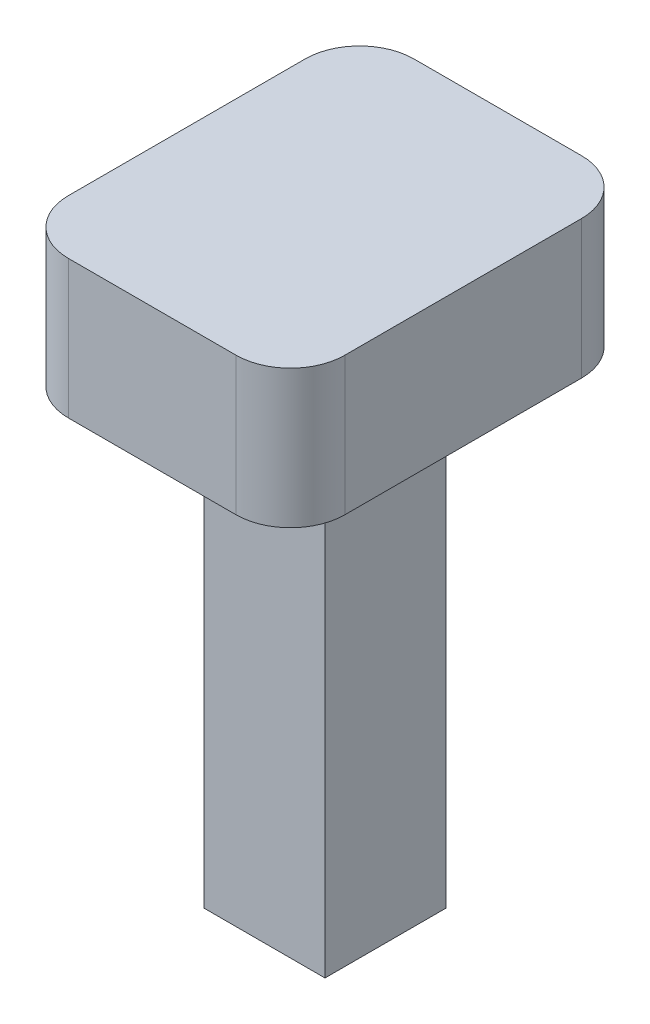
ISO-10303-21;
HEADER;
FILE_DESCRIPTION(('STEP AP214'),'2;1');
FILE_NAME('part.step','',(''),(''),'','','');
FILE_SCHEMA(('AUTOMOTIVE_DESIGN { 1 0 10303 214 1 1 1 1 }'));
ENDSEC;
DATA;
#1=APPLICATION_CONTEXT('core data for automotive mechanical design processes');
#2=APPLICATION_PROTOCOL_DEFINITION('international standard','automotive_design',2000,#1);
#3=PRODUCT_CONTEXT('',#1,'mechanical');
#4=PRODUCT('Part','Part','',(#3));
#5=PRODUCT_RELATED_PRODUCT_CATEGORY('part','',(#4));
#6=PRODUCT_DEFINITION_FORMATION('','',#4);
#7=PRODUCT_DEFINITION_CONTEXT('part definition',#1,'design');
#8=PRODUCT_DEFINITION('design','',#6,#7);
#9=PRODUCT_DEFINITION_SHAPE('','',#8);
#10=(LENGTH_UNIT() NAMED_UNIT(*) SI_UNIT(.MILLI.,.METRE.));
#11=(NAMED_UNIT(*) PLANE_ANGLE_UNIT() SI_UNIT($,.RADIAN.));
#12=(NAMED_UNIT(*) SI_UNIT($,.STERADIAN.) SOLID_ANGLE_UNIT());
#13=UNCERTAINTY_MEASURE_WITH_UNIT(LENGTH_MEASURE(1.E-05),#10,'distance_accuracy_value','');
#14=(GEOMETRIC_REPRESENTATION_CONTEXT(3) GLOBAL_UNCERTAINTY_ASSIGNED_CONTEXT((#13)) GLOBAL_UNIT_ASSIGNED_CONTEXT((#10,
#11,#12)) REPRESENTATION_CONTEXT('',''));
#15=CARTESIAN_POINT('',(0.,0.,0.));
#16=DIRECTION('',(0.,0.,1.));
#17=DIRECTION('',(1.,0.,0.));
#18=AXIS2_PLACEMENT_3D('',#15,#16,#17);
#19=CARTESIAN_POINT('',(1.3875,10.775,-1.3875));
#20=DIRECTION('',(-1.,0.,0.));
#21=DIRECTION('',(0.,0.,1.));
#22=AXIS2_PLACEMENT_3D('',#19,#20,#21);
#23=PLANE('',#22);
#24=DIRECTION('',(0.,-1.,0.));
#25=VECTOR('',#24,1.);
#26=CARTESIAN_POINT('',(1.3875,10.775,-1.3875));
#27=LINE('',#26,#25);
#28=CARTESIAN_POINT('',(1.3875,9.525,-1.3875));
#29=VERTEX_POINT('',#28);
#30=CARTESIAN_POINT('',(1.3875,0.,-1.3875));
#31=VERTEX_POINT('',#30);
#32=EDGE_CURVE('E151',#29,#31,#27,.T.);
#33=ORIENTED_EDGE('',*,*,#32,.F.);
#34=DIRECTION('',(0.,0.,-1.));
#35=VECTOR('',#34,1.);
#36=CARTESIAN_POINT('',(1.3875,9.525,1.3875));
#37=LINE('',#36,#35);
#38=CARTESIAN_POINT('',(1.3875,9.525,1.3875));
#39=VERTEX_POINT('',#38);
#40=EDGE_CURVE('E225',#29,#39,#37,.F.);
#41=ORIENTED_EDGE('',*,*,#40,.T.);
#42=DIRECTION('',(0.,-1.,0.));
#43=VECTOR('',#42,1.);
#44=CARTESIAN_POINT('',(1.3875,10.775,1.3875));
#45=LINE('',#44,#43);
#46=CARTESIAN_POINT('',(1.3875,0.,1.3875));
#47=VERTEX_POINT('',#46);
#48=EDGE_CURVE('E175',#39,#47,#45,.T.);
#49=ORIENTED_EDGE('',*,*,#48,.T.);
#50=DIRECTION('',(0.,0.,-1.));
#51=VECTOR('',#50,1.);
#52=CARTESIAN_POINT('',(1.3875,0.,-1.3875));
#53=LINE('',#52,#51);
#54=EDGE_CURVE('E169',#47,#31,#53,.T.);
#55=ORIENTED_EDGE('',*,*,#54,.T.);
#56=EDGE_LOOP('',(#33,#41,#49,#55));
#57=FACE_BOUND('',#56,.T.);
#58=ADVANCED_FACE('F45',(#57),#23,.F.);
#59=CARTESIAN_POINT('',(-1.3875,10.775,-1.3875));
#60=DIRECTION('',(0.,0.,1.));
#61=DIRECTION('',(1.,0.,0.));
#62=AXIS2_PLACEMENT_3D('',#59,#60,#61);
#63=PLANE('',#62);
#64=DIRECTION('',(0.,-1.,0.));
#65=VECTOR('',#64,1.);
#66=CARTESIAN_POINT('',(-1.3875,10.775,-1.3875));
#67=LINE('',#66,#65);
#68=CARTESIAN_POINT('',(-1.3875,9.525,-1.3875));
#69=VERTEX_POINT('',#68);
#70=CARTESIAN_POINT('',(-1.3875,0.,-1.3875));
#71=VERTEX_POINT('',#70);
#72=EDGE_CURVE('E163',#69,#71,#67,.T.);
#73=ORIENTED_EDGE('',*,*,#72,.F.);
#74=DIRECTION('',(-1.,0.,0.));
#75=VECTOR('',#74,1.);
#76=CARTESIAN_POINT('',(1.3875,9.525,-1.3875));
#77=LINE('',#76,#75);
#78=EDGE_CURVE('E158',#69,#29,#77,.F.);
#79=ORIENTED_EDGE('',*,*,#78,.T.);
#80=ORIENTED_EDGE('',*,*,#32,.T.);
#81=DIRECTION('',(-1.,0.,0.));
#82=VECTOR('',#81,1.);
#83=CARTESIAN_POINT('',(-1.3875,0.,-1.3875));
#84=LINE('',#83,#82);
#85=EDGE_CURVE('E155',#31,#71,#84,.T.);
#86=ORIENTED_EDGE('',*,*,#85,.T.);
#87=EDGE_LOOP('',(#73,#79,#80,#86));
#88=FACE_BOUND('',#87,.T.);
#89=ADVANCED_FACE('F154',(#88),#63,.F.);
#90=CARTESIAN_POINT('',(-1.3875,10.775,-1.3875));
#91=DIRECTION('',(1.,0.,0.));
#92=DIRECTION('',(0.,0.,-1.));
#93=AXIS2_PLACEMENT_3D('',#90,#91,#92);
#94=PLANE('',#93);
#95=DIRECTION('',(0.,-1.,0.));
#96=VECTOR('',#95,1.);
#97=CARTESIAN_POINT('',(-1.3875,10.775,1.3875));
#98=LINE('',#97,#96);
#99=CARTESIAN_POINT('',(-1.3875,9.525,1.3875));
#100=VERTEX_POINT('',#99);
#101=CARTESIAN_POINT('',(-1.3875,0.,1.3875));
#102=VERTEX_POINT('',#101);
#103=EDGE_CURVE('E194',#100,#102,#98,.T.);
#104=ORIENTED_EDGE('',*,*,#103,.F.);
#105=DIRECTION('',(0.,0.,1.));
#106=VECTOR('',#105,1.);
#107=CARTESIAN_POINT('',(-1.3875,9.525,-1.3875));
#108=LINE('',#107,#106);
#109=EDGE_CURVE('E231',#100,#69,#108,.F.);
#110=ORIENTED_EDGE('',*,*,#109,.T.);
#111=ORIENTED_EDGE('',*,*,#72,.T.);
#112=DIRECTION('',(0.,0.,1.));
#113=VECTOR('',#112,1.);
#114=CARTESIAN_POINT('',(-1.3875,0.,-1.3875));
#115=LINE('',#114,#113);
#116=EDGE_CURVE('E171',#71,#102,#115,.T.);
#117=ORIENTED_EDGE('',*,*,#116,.T.);
#118=EDGE_LOOP('',(#104,#110,#111,#117));
#119=FACE_BOUND('',#118,.T.);
#120=ADVANCED_FACE('F356',(#119),#94,.F.);
#121=CARTESIAN_POINT('',(-1.3875,10.775,1.3875));
#122=DIRECTION('',(0.,0.,-1.));
#123=DIRECTION('',(-1.,0.,0.));
#124=AXIS2_PLACEMENT_3D('',#121,#122,#123);
#125=PLANE('',#124);
#126=ORIENTED_EDGE('',*,*,#48,.F.);
#127=DIRECTION('',(1.,0.,0.));
#128=VECTOR('',#127,1.);
#129=CARTESIAN_POINT('',(-1.3875,9.525,1.3875));
#130=LINE('',#129,#128);
#131=EDGE_CURVE('E228',#39,#100,#130,.F.);
#132=ORIENTED_EDGE('',*,*,#131,.T.);
#133=ORIENTED_EDGE('',*,*,#103,.T.);
#134=DIRECTION('',(1.,0.,0.));
#135=VECTOR('',#134,1.);
#136=CARTESIAN_POINT('',(-1.3875,0.,1.3875));
#137=LINE('',#136,#135);
#138=EDGE_CURVE('E189',#102,#47,#137,.T.);
#139=ORIENTED_EDGE('',*,*,#138,.T.);
#140=EDGE_LOOP('',(#126,#132,#133,#139));
#141=FACE_BOUND('',#140,.T.);
#142=ADVANCED_FACE('F474',(#141),#125,.F.);
#143=CARTESIAN_POINT('',(0.,0.,0.));
#144=DIRECTION('',(0.,1.,0.));
#145=DIRECTION('',(0.,0.,1.));
#146=AXIS2_PLACEMENT_3D('',#143,#144,#145);
#147=PLANE('',#146);
#148=ORIENTED_EDGE('',*,*,#54,.F.);
#149=ORIENTED_EDGE('',*,*,#138,.F.);
#150=ORIENTED_EDGE('',*,*,#116,.F.);
#151=ORIENTED_EDGE('',*,*,#85,.F.);
#152=EDGE_LOOP('',(#148,#149,#150,#151));
#153=FACE_BOUND('',#152,.T.);
#154=ADVANCED_FACE('F167',(#153),#147,.F.);
#155=CARTESIAN_POINT('',(0.,10.775,0.));
#156=DIRECTION('',(0.,1.,0.));
#157=DIRECTION('',(0.,0.,1.));
#158=AXIS2_PLACEMENT_3D('',#155,#156,#157);
#159=PLANE('',#158);
#160=DIRECTION('',(0.,0.,-1.));
#161=VECTOR('',#160,1.);
#162=CARTESIAN_POINT('',(2.6375,10.775,-1.3875));
#163=LINE('',#162,#161);
#164=CARTESIAN_POINT('',(2.6375,10.775,2.6375));
#165=VERTEX_POINT('',#164);
#166=CARTESIAN_POINT('',(2.6375,10.775,-2.6375));
#167=VERTEX_POINT('',#166);
#168=EDGE_CURVE('E216',#165,#167,#163,.T.);
#169=ORIENTED_EDGE('',*,*,#168,.T.);
#170=DIRECTION('',(-1.,0.,0.));
#171=VECTOR('',#170,1.);
#172=CARTESIAN_POINT('',(-1.3875,10.775,-2.6375));
#173=LINE('',#172,#171);
#174=CARTESIAN_POINT('',(-2.6375,10.775,-2.6375));
#175=VERTEX_POINT('',#174);
#176=EDGE_CURVE('E219',#167,#175,#173,.T.);
#177=ORIENTED_EDGE('',*,*,#176,.T.);
#178=DIRECTION('',(0.,0.,1.));
#179=VECTOR('',#178,1.);
#180=CARTESIAN_POINT('',(-2.6375,10.775,1.3875));
#181=LINE('',#180,#179);
#182=CARTESIAN_POINT('',(-2.6375,10.775,2.6375));
#183=VERTEX_POINT('',#182);
#184=EDGE_CURVE('E210',#175,#183,#181,.T.);
#185=ORIENTED_EDGE('',*,*,#184,.T.);
#186=DIRECTION('',(1.,0.,0.));
#187=VECTOR('',#186,1.);
#188=CARTESIAN_POINT('',(1.3875,10.775,2.6375));
#189=LINE('',#188,#187);
#190=EDGE_CURVE('E213',#183,#165,#189,.T.);
#191=ORIENTED_EDGE('',*,*,#190,.T.);
#192=EDGE_LOOP('',(#169,#177,#185,#191));
#193=FACE_BOUND('',#192,.T.);
#194=DIRECTION('',(0.,0.,1.));
#195=VECTOR('',#194,1.);
#196=CARTESIAN_POINT('',(-3.175,10.775,-3.96875));
#197=LINE('',#196,#195);
#198=CARTESIAN_POINT('',(-3.175,10.775,-2.71875));
#199=VERTEX_POINT('',#198);
#200=CARTESIAN_POINT('',(-3.175,10.775,2.71875));
#201=VERTEX_POINT('',#200);
#202=EDGE_CURVE('E296',#199,#201,#197,.T.);
#203=ORIENTED_EDGE('',*,*,#202,.F.);
#204=CARTESIAN_POINT('',(-1.925,10.775,-2.71875));
#205=DIRECTION('',(0.,1.,0.));
#206=DIRECTION('',(0.,0.,1.));
#207=AXIS2_PLACEMENT_3D('',#204,#205,#206);
#208=CIRCLE('',#207,1.25);
#209=CARTESIAN_POINT('',(-1.925,10.775,-3.96875));
#210=VERTEX_POINT('',#209);
#211=EDGE_CURVE('E207',#199,#210,#208,.F.);
#212=ORIENTED_EDGE('',*,*,#211,.T.);
#213=DIRECTION('',(-1.,0.,0.));
#214=VECTOR('',#213,1.);
#215=CARTESIAN_POINT('',(-3.175,10.775,-3.96875));
#216=LINE('',#215,#214);
#217=CARTESIAN_POINT('',(1.925,10.775,-3.96875));
#218=VERTEX_POINT('',#217);
#219=EDGE_CURVE('E289',#218,#210,#216,.T.);
#220=ORIENTED_EDGE('',*,*,#219,.F.);
#221=CARTESIAN_POINT('',(1.925,10.775,-2.71875));
#222=DIRECTION('',(0.,1.,0.));
#223=DIRECTION('',(0.,0.,1.));
#224=AXIS2_PLACEMENT_3D('',#221,#222,#223);
#225=CIRCLE('',#224,1.25);
#226=CARTESIAN_POINT('',(3.175,10.775,-2.71875));
#227=VERTEX_POINT('',#226);
#228=EDGE_CURVE('E204',#218,#227,#225,.F.);
#229=ORIENTED_EDGE('',*,*,#228,.T.);
#230=DIRECTION('',(0.,0.,-1.));
#231=VECTOR('',#230,1.);
#232=CARTESIAN_POINT('',(3.175,10.775,-3.96875));
#233=LINE('',#232,#231);
#234=CARTESIAN_POINT('',(3.175,10.775,2.71875));
#235=VERTEX_POINT('',#234);
#236=EDGE_CURVE('E282',#235,#227,#233,.T.);
#237=ORIENTED_EDGE('',*,*,#236,.F.);
#238=CARTESIAN_POINT('',(1.925,10.775,2.71875));
#239=DIRECTION('',(0.,1.,0.));
#240=DIRECTION('',(0.,0.,1.));
#241=AXIS2_PLACEMENT_3D('',#238,#239,#240);
#242=CIRCLE('',#241,1.25);
#243=CARTESIAN_POINT('',(1.925,10.775,3.96875));
#244=VERTEX_POINT('',#243);
#245=EDGE_CURVE('E162',#235,#244,#242,.F.);
#246=ORIENTED_EDGE('',*,*,#245,.T.);
#247=DIRECTION('',(1.,0.,0.));
#248=VECTOR('',#247,1.);
#249=CARTESIAN_POINT('',(-3.175,10.775,3.96875));
#250=LINE('',#249,#248);
#251=CARTESIAN_POINT('',(-1.925,10.775,3.96875));
#252=VERTEX_POINT('',#251);
#253=EDGE_CURVE('E184',#252,#244,#250,.T.);
#254=ORIENTED_EDGE('',*,*,#253,.F.);
#255=CARTESIAN_POINT('',(-1.925,10.775,2.71875));
#256=DIRECTION('',(0.,1.,0.));
#257=DIRECTION('',(0.,0.,1.));
#258=AXIS2_PLACEMENT_3D('',#255,#256,#257);
#259=CIRCLE('',#258,1.25);
#260=EDGE_CURVE('E201',#252,#201,#259,.F.);
#261=ORIENTED_EDGE('',*,*,#260,.T.);
#262=EDGE_LOOP('',(#203,#212,#220,#229,#237,#246,#254,#261));
#263=FACE_BOUND('',#262,.T.);
#264=ADVANCED_FACE('F326',(#193,#263),#159,.F.);
#265=CARTESIAN_POINT('',(3.175,13.95,-3.96875));
#266=DIRECTION('',(-1.,0.,0.));
#267=DIRECTION('',(0.,0.,1.));
#268=AXIS2_PLACEMENT_3D('',#265,#266,#267);
#269=PLANE('',#268);
#270=ORIENTED_EDGE('',*,*,#236,.T.);
#271=DIRECTION('',(0.,-1.,0.));
#272=VECTOR('',#271,1.);
#273=CARTESIAN_POINT('',(3.175,13.95,-2.71875));
#274=LINE('',#273,#272);
#275=CARTESIAN_POINT('',(3.175,13.95,-2.71875));
#276=VERTEX_POINT('',#275);
#277=EDGE_CURVE('E263',#227,#276,#274,.F.);
#278=ORIENTED_EDGE('',*,*,#277,.T.);
#279=DIRECTION('',(0.,0.,-1.));
#280=VECTOR('',#279,1.);
#281=CARTESIAN_POINT('',(3.175,13.95,-3.96875));
#282=LINE('',#281,#280);
#283=CARTESIAN_POINT('',(3.175,13.95,2.71875));
#284=VERTEX_POINT('',#283);
#285=EDGE_CURVE('E305',#284,#276,#282,.T.);
#286=ORIENTED_EDGE('',*,*,#285,.F.);
#287=DIRECTION('',(0.,-1.,0.));
#288=VECTOR('',#287,1.);
#289=CARTESIAN_POINT('',(3.175,13.95,2.71875));
#290=LINE('',#289,#288);
#291=EDGE_CURVE('E259',#284,#235,#290,.T.);
#292=ORIENTED_EDGE('',*,*,#291,.T.);
#293=EDGE_LOOP('',(#270,#278,#286,#292));
#294=FACE_BOUND('',#293,.T.);
#295=ADVANCED_FACE('F330',(#294),#269,.F.);
#296=CARTESIAN_POINT('',(-3.175,13.95,-3.96875));
#297=DIRECTION('',(0.,0.,1.));
#298=DIRECTION('',(1.,0.,0.));
#299=AXIS2_PLACEMENT_3D('',#296,#297,#298);
#300=PLANE('',#299);
#301=ORIENTED_EDGE('',*,*,#219,.T.);
#302=DIRECTION('',(0.,-1.,0.));
#303=VECTOR('',#302,1.);
#304=CARTESIAN_POINT('',(-1.925,13.95,-3.96875));
#305=LINE('',#304,#303);
#306=CARTESIAN_POINT('',(-1.925,13.95,-3.96875));
#307=VERTEX_POINT('',#306);
#308=EDGE_CURVE('E245',#210,#307,#305,.F.);
#309=ORIENTED_EDGE('',*,*,#308,.T.);
#310=DIRECTION('',(-1.,0.,0.));
#311=VECTOR('',#310,1.);
#312=CARTESIAN_POINT('',(-3.175,13.95,-3.96875));
#313=LINE('',#312,#311);
#314=CARTESIAN_POINT('',(1.925,13.95,-3.96875));
#315=VERTEX_POINT('',#314);
#316=EDGE_CURVE('E309',#315,#307,#313,.T.);
#317=ORIENTED_EDGE('',*,*,#316,.F.);
#318=DIRECTION('',(0.,-1.,0.));
#319=VECTOR('',#318,1.);
#320=CARTESIAN_POINT('',(1.925,13.95,-3.96875));
#321=LINE('',#320,#319);
#322=EDGE_CURVE('E241',#315,#218,#321,.T.);
#323=ORIENTED_EDGE('',*,*,#322,.T.);
#324=EDGE_LOOP('',(#301,#309,#317,#323));
#325=FACE_BOUND('',#324,.T.);
#326=ADVANCED_FACE('F336',(#325),#300,.F.);
#327=CARTESIAN_POINT('',(-3.175,13.95,-3.96875));
#328=DIRECTION('',(1.,0.,0.));
#329=DIRECTION('',(0.,0.,-1.));
#330=AXIS2_PLACEMENT_3D('',#327,#328,#329);
#331=PLANE('',#330);
#332=DIRECTION('',(0.,0.,1.));
#333=VECTOR('',#332,1.);
#334=CARTESIAN_POINT('',(-3.175,13.95,-3.96875));
#335=LINE('',#334,#333);
#336=CARTESIAN_POINT('',(-3.175,13.95,-2.71875));
#337=VERTEX_POINT('',#336);
#338=CARTESIAN_POINT('',(-3.175,13.95,2.71875));
#339=VERTEX_POINT('',#338);
#340=EDGE_CURVE('E181',#337,#339,#335,.T.);
#341=ORIENTED_EDGE('',*,*,#340,.F.);
#342=DIRECTION('',(0.,-1.,0.));
#343=VECTOR('',#342,1.);
#344=CARTESIAN_POINT('',(-3.175,13.95,-2.71875));
#345=LINE('',#344,#343);
#346=EDGE_CURVE('E237',#337,#199,#345,.T.);
#347=ORIENTED_EDGE('',*,*,#346,.T.);
#348=ORIENTED_EDGE('',*,*,#202,.T.);
#349=DIRECTION('',(0.,-1.,0.));
#350=VECTOR('',#349,1.);
#351=CARTESIAN_POINT('',(-3.175,13.95,2.71875));
#352=LINE('',#351,#350);
#353=EDGE_CURVE('E234',#201,#339,#352,.F.);
#354=ORIENTED_EDGE('',*,*,#353,.T.);
#355=EDGE_LOOP('',(#341,#347,#348,#354));
#356=FACE_BOUND('',#355,.T.);
#357=ADVANCED_FACE('F341',(#356),#331,.F.);
#358=CARTESIAN_POINT('',(-3.175,13.95,3.96875));
#359=DIRECTION('',(0.,0.,-1.));
#360=DIRECTION('',(-1.,0.,0.));
#361=AXIS2_PLACEMENT_3D('',#358,#359,#360);
#362=PLANE('',#361);
#363=DIRECTION('',(1.,0.,0.));
#364=VECTOR('',#363,1.);
#365=CARTESIAN_POINT('',(-3.175,13.95,3.96875));
#366=LINE('',#365,#364);
#367=CARTESIAN_POINT('',(-1.925,13.95,3.96875));
#368=VERTEX_POINT('',#367);
#369=CARTESIAN_POINT('',(1.925,13.95,3.96875));
#370=VERTEX_POINT('',#369);
#371=EDGE_CURVE('E178',#368,#370,#366,.T.);
#372=ORIENTED_EDGE('',*,*,#371,.F.);
#373=DIRECTION('',(0.,-1.,0.));
#374=VECTOR('',#373,1.);
#375=CARTESIAN_POINT('',(-1.925,13.95,3.96875));
#376=LINE('',#375,#374);
#377=EDGE_CURVE('E11',#368,#252,#376,.T.);
#378=ORIENTED_EDGE('',*,*,#377,.T.);
#379=ORIENTED_EDGE('',*,*,#253,.T.);
#380=DIRECTION('',(0.,-1.,0.));
#381=VECTOR('',#380,1.);
#382=CARTESIAN_POINT('',(1.925,13.95,3.96875));
#383=LINE('',#382,#381);
#384=EDGE_CURVE('E55',#244,#370,#383,.F.);
#385=ORIENTED_EDGE('',*,*,#384,.T.);
#386=EDGE_LOOP('',(#372,#378,#379,#385));
#387=FACE_BOUND('',#386,.T.);
#388=ADVANCED_FACE('F324',(#387),#362,.F.);
#389=CARTESIAN_POINT('',(0.,13.95,0.));
#390=DIRECTION('',(0.,1.,0.));
#391=DIRECTION('',(0.,0.,1.));
#392=AXIS2_PLACEMENT_3D('',#389,#390,#391);
#393=PLANE('',#392);
#394=ORIENTED_EDGE('',*,*,#316,.T.);
#395=CARTESIAN_POINT('',(-1.925,13.95,-2.71875));
#396=DIRECTION('',(0.,1.,0.));
#397=DIRECTION('',(0.,0.,1.));
#398=AXIS2_PLACEMENT_3D('',#395,#396,#397);
#399=CIRCLE('',#398,1.25);
#400=EDGE_CURVE('E256',#307,#337,#399,.T.);
#401=ORIENTED_EDGE('',*,*,#400,.T.);
#402=ORIENTED_EDGE('',*,*,#340,.T.);
#403=CARTESIAN_POINT('',(-1.925,13.95,2.71875));
#404=DIRECTION('',(0.,1.,0.));
#405=DIRECTION('',(0.,0.,1.));
#406=AXIS2_PLACEMENT_3D('',#403,#404,#405);
#407=CIRCLE('',#406,1.25);
#408=EDGE_CURVE('E69',#339,#368,#407,.T.);
#409=ORIENTED_EDGE('',*,*,#408,.T.);
#410=ORIENTED_EDGE('',*,*,#371,.T.);
#411=CARTESIAN_POINT('',(1.925,13.95,2.71875));
#412=DIRECTION('',(0.,1.,0.));
#413=DIRECTION('',(0.,0.,1.));
#414=AXIS2_PLACEMENT_3D('',#411,#412,#413);
#415=CIRCLE('',#414,1.25);
#416=EDGE_CURVE('E248',#370,#284,#415,.T.);
#417=ORIENTED_EDGE('',*,*,#416,.T.);
#418=ORIENTED_EDGE('',*,*,#285,.T.);
#419=CARTESIAN_POINT('',(1.925,13.95,-2.71875));
#420=DIRECTION('',(0.,1.,0.));
#421=DIRECTION('',(0.,0.,1.));
#422=AXIS2_PLACEMENT_3D('',#419,#420,#421);
#423=CIRCLE('',#422,1.25);
#424=EDGE_CURVE('E253',#276,#315,#423,.T.);
#425=ORIENTED_EDGE('',*,*,#424,.T.);
#426=EDGE_LOOP('',(#394,#401,#402,#409,#410,#417,#418,#425));
#427=FACE_BOUND('',#426,.T.);
#428=ADVANCED_FACE('F318',(#427),#393,.T.);
#429=CARTESIAN_POINT('',(0.,9.525,2.6375));
#430=DIRECTION('',(-1.,0.,0.));
#431=DIRECTION('',(0.,0.,1.));
#432=AXIS2_PLACEMENT_3D('',#429,#430,#431);
#433=CYLINDRICAL_SURFACE('',#432,1.25);
#434=CARTESIAN_POINT('',(-2.6375,9.525,2.6375));
#435=DIRECTION('',(-0.707106781186547,0.,-0.707106781186547));
#436=DIRECTION('',(0.707106781186547,0.,-0.707106781186547));
#437=AXIS2_PLACEMENT_3D('',#434,#435,#436);
#438=ELLIPSE('',#437,1.76776695296637,1.25);
#439=EDGE_CURVE('E273',#100,#183,#438,.F.);
#440=ORIENTED_EDGE('',*,*,#439,.F.);
#441=ORIENTED_EDGE('',*,*,#131,.F.);
#442=CARTESIAN_POINT('',(2.6375,9.525,2.6375));
#443=DIRECTION('',(-0.707106781186547,0.,0.707106781186547));
#444=DIRECTION('',(-0.707106781186547,0.,-0.707106781186547));
#445=AXIS2_PLACEMENT_3D('',#442,#443,#444);
#446=ELLIPSE('',#445,1.76776695296637,1.25);
#447=EDGE_CURVE('E49',#165,#39,#446,.T.);
#448=ORIENTED_EDGE('',*,*,#447,.F.);
#449=ORIENTED_EDGE('',*,*,#190,.F.);
#450=EDGE_LOOP('',(#440,#441,#448,#449));
#451=FACE_BOUND('',#450,.T.);
#452=ADVANCED_FACE('F370',(#451),#433,.F.);
#453=CARTESIAN_POINT('',(2.6375,9.525,0.));
#454=DIRECTION('',(0.,0.,1.));
#455=DIRECTION('',(1.,0.,0.));
#456=AXIS2_PLACEMENT_3D('',#453,#454,#455);
#457=CYLINDRICAL_SURFACE('',#456,1.25);
#458=ORIENTED_EDGE('',*,*,#447,.T.);
#459=ORIENTED_EDGE('',*,*,#40,.F.);
#460=CARTESIAN_POINT('',(2.6375,9.525,-2.6375));
#461=DIRECTION('',(0.707106781186547,0.,0.707106781186547));
#462=DIRECTION('',(-0.707106781186547,0.,0.707106781186547));
#463=AXIS2_PLACEMENT_3D('',#460,#461,#462);
#464=ELLIPSE('',#463,1.76776695296637,1.25);
#465=EDGE_CURVE('E271',#167,#29,#464,.T.);
#466=ORIENTED_EDGE('',*,*,#465,.F.);
#467=ORIENTED_EDGE('',*,*,#168,.F.);
#468=EDGE_LOOP('',(#458,#459,#466,#467));
#469=FACE_BOUND('',#468,.T.);
#470=ADVANCED_FACE('F367',(#469),#457,.F.);
#471=CARTESIAN_POINT('',(-2.6375,9.525,0.));
#472=DIRECTION('',(0.,0.,-1.));
#473=DIRECTION('',(-1.,0.,0.));
#474=AXIS2_PLACEMENT_3D('',#471,#472,#473);
#475=CYLINDRICAL_SURFACE('',#474,1.25);
#476=ORIENTED_EDGE('',*,*,#439,.T.);
#477=ORIENTED_EDGE('',*,*,#184,.F.);
#478=CARTESIAN_POINT('',(-2.6375,9.525,-2.6375));
#479=DIRECTION('',(0.707106781186547,0.,-0.707106781186547));
#480=DIRECTION('',(-0.707106781186547,0.,-0.707106781186547));
#481=AXIS2_PLACEMENT_3D('',#478,#479,#480);
#482=ELLIPSE('',#481,1.76776695296637,1.25);
#483=EDGE_CURVE('E268',#69,#175,#482,.F.);
#484=ORIENTED_EDGE('',*,*,#483,.F.);
#485=ORIENTED_EDGE('',*,*,#109,.F.);
#486=EDGE_LOOP('',(#476,#477,#484,#485));
#487=FACE_BOUND('',#486,.T.);
#488=ADVANCED_FACE('F363',(#487),#475,.F.);
#489=CARTESIAN_POINT('',(0.,9.525,-2.6375));
#490=DIRECTION('',(1.,0.,0.));
#491=DIRECTION('',(0.,0.,-1.));
#492=AXIS2_PLACEMENT_3D('',#489,#490,#491);
#493=CYLINDRICAL_SURFACE('',#492,1.25);
#494=ORIENTED_EDGE('',*,*,#465,.T.);
#495=ORIENTED_EDGE('',*,*,#78,.F.);
#496=ORIENTED_EDGE('',*,*,#483,.T.);
#497=ORIENTED_EDGE('',*,*,#176,.F.);
#498=EDGE_LOOP('',(#494,#495,#496,#497));
#499=FACE_BOUND('',#498,.T.);
#500=ADVANCED_FACE('F360',(#499),#493,.F.);
#501=CARTESIAN_POINT('',(-1.925,13.95,-2.71875));
#502=DIRECTION('',(0.,-1.,0.));
#503=DIRECTION('',(0.,0.,-1.));
#504=AXIS2_PLACEMENT_3D('',#501,#502,#503);
#505=CYLINDRICAL_SURFACE('',#504,1.25);
#506=ORIENTED_EDGE('',*,*,#400,.F.);
#507=ORIENTED_EDGE('',*,*,#308,.F.);
#508=ORIENTED_EDGE('',*,*,#211,.F.);
#509=ORIENTED_EDGE('',*,*,#346,.F.);
#510=EDGE_LOOP('',(#506,#507,#508,#509));
#511=FACE_BOUND('',#510,.T.);
#512=ADVANCED_FACE('F340',(#511),#505,.T.);
#513=CARTESIAN_POINT('',(1.925,13.95,-2.71875));
#514=DIRECTION('',(0.,-1.,0.));
#515=DIRECTION('',(0.,0.,-1.));
#516=AXIS2_PLACEMENT_3D('',#513,#514,#515);
#517=CYLINDRICAL_SURFACE('',#516,1.25);
#518=ORIENTED_EDGE('',*,*,#424,.F.);
#519=ORIENTED_EDGE('',*,*,#277,.F.);
#520=ORIENTED_EDGE('',*,*,#228,.F.);
#521=ORIENTED_EDGE('',*,*,#322,.F.);
#522=EDGE_LOOP('',(#518,#519,#520,#521));
#523=FACE_BOUND('',#522,.T.);
#524=ADVANCED_FACE('F332',(#523),#517,.T.);
#525=CARTESIAN_POINT('',(-1.925,13.95,2.71875));
#526=DIRECTION('',(0.,-1.,0.));
#527=DIRECTION('',(0.,0.,-1.));
#528=AXIS2_PLACEMENT_3D('',#525,#526,#527);
#529=CYLINDRICAL_SURFACE('',#528,1.25);
#530=ORIENTED_EDGE('',*,*,#408,.F.);
#531=ORIENTED_EDGE('',*,*,#353,.F.);
#532=ORIENTED_EDGE('',*,*,#260,.F.);
#533=ORIENTED_EDGE('',*,*,#377,.F.);
#534=EDGE_LOOP('',(#530,#531,#532,#533));
#535=FACE_BOUND('',#534,.T.);
#536=ADVANCED_FACE('F323',(#535),#529,.T.);
#537=CARTESIAN_POINT('',(1.925,13.95,2.71875));
#538=DIRECTION('',(0.,-1.,0.));
#539=DIRECTION('',(0.,0.,-1.));
#540=AXIS2_PLACEMENT_3D('',#537,#538,#539);
#541=CYLINDRICAL_SURFACE('',#540,1.25);
#542=ORIENTED_EDGE('',*,*,#416,.F.);
#543=ORIENTED_EDGE('',*,*,#384,.F.);
#544=ORIENTED_EDGE('',*,*,#245,.F.);
#545=ORIENTED_EDGE('',*,*,#291,.F.);
#546=EDGE_LOOP('',(#542,#543,#544,#545));
#547=FACE_BOUND('',#546,.T.);
#548=ADVANCED_FACE('F47',(#547),#541,.T.);
#549=CLOSED_SHELL('',(#58,#89,#120,#142,#154,#264,#295,#326,#357,#388,#428,#452,#470,#488,#500,
#512,#524,#536,#548));
#550=MANIFOLD_SOLID_BREP('B2',#549);
#551=ADVANCED_BREP_SHAPE_REPRESENTATION('',(#18,#550),#14);
#552=SHAPE_DEFINITION_REPRESENTATION(#9,#551);
ENDSEC;
END-ISO-10303-21;
